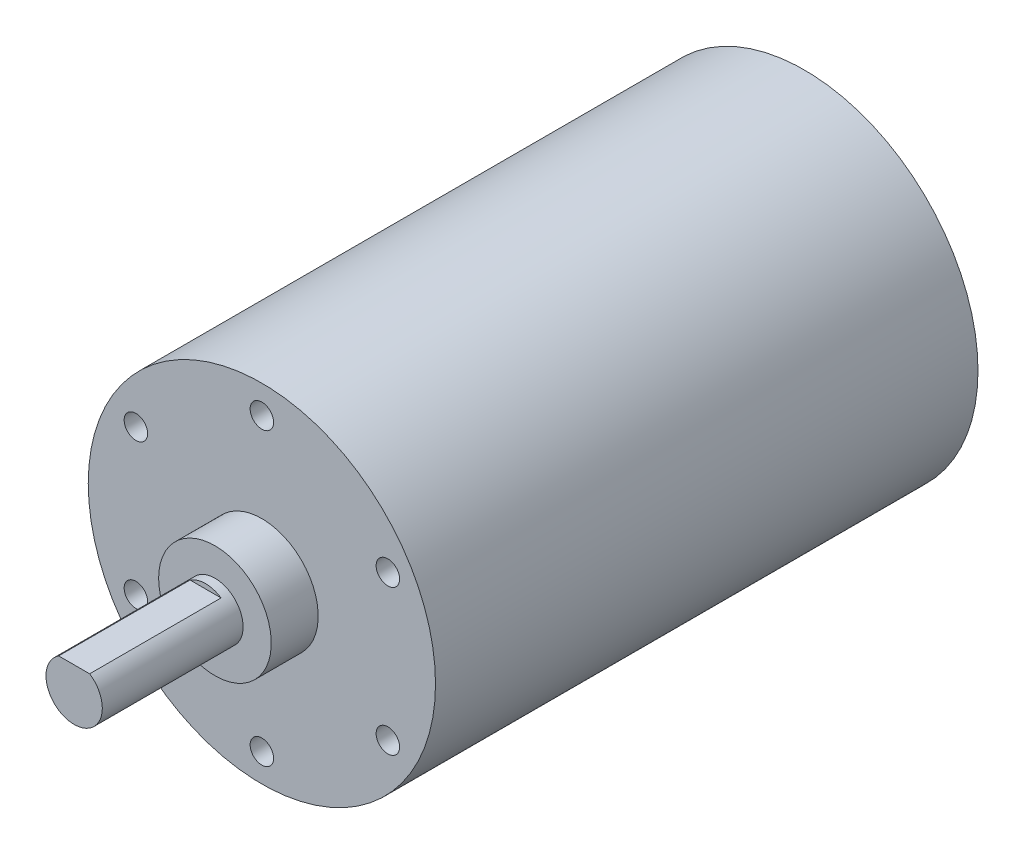
ISO-10303-21;
HEADER;
FILE_DESCRIPTION(('STEP AP214'),'2;1');
FILE_NAME('part.step','',(''),(''),'','','');
FILE_SCHEMA(('AUTOMOTIVE_DESIGN { 1 0 10303 214 1 1 1 1 }'));
ENDSEC;
DATA;
#1=APPLICATION_CONTEXT('core data for automotive mechanical design processes');
#2=APPLICATION_PROTOCOL_DEFINITION('international standard','automotive_design',2000,#1);
#3=PRODUCT_CONTEXT('',#1,'mechanical');
#4=PRODUCT('Part','Part','',(#3));
#5=PRODUCT_RELATED_PRODUCT_CATEGORY('part','',(#4));
#6=PRODUCT_DEFINITION_FORMATION('','',#4);
#7=PRODUCT_DEFINITION_CONTEXT('part definition',#1,'design');
#8=PRODUCT_DEFINITION('design','',#6,#7);
#9=PRODUCT_DEFINITION_SHAPE('','',#8);
#10=(LENGTH_UNIT() NAMED_UNIT(*) SI_UNIT(.MILLI.,.METRE.));
#11=(NAMED_UNIT(*) PLANE_ANGLE_UNIT() SI_UNIT($,.RADIAN.));
#12=(NAMED_UNIT(*) SI_UNIT($,.STERADIAN.) SOLID_ANGLE_UNIT());
#13=UNCERTAINTY_MEASURE_WITH_UNIT(LENGTH_MEASURE(1.E-05),#10,'distance_accuracy_value','');
#14=(GEOMETRIC_REPRESENTATION_CONTEXT(3) GLOBAL_UNCERTAINTY_ASSIGNED_CONTEXT((#13)) GLOBAL_UNIT_ASSIGNED_CONTEXT((#10,
#11,#12)) REPRESENTATION_CONTEXT('',''));
#15=CARTESIAN_POINT('',(0.,0.,0.));
#16=DIRECTION('',(0.,0.,1.));
#17=DIRECTION('',(1.,0.,0.));
#18=AXIS2_PLACEMENT_3D('',#15,#16,#17);
#19=CARTESIAN_POINT('',(0.,0.,-57.8000114));
#20=DIRECTION('',(0.,0.,1.));
#21=DIRECTION('',(1.,0.,0.));
#22=AXIS2_PLACEMENT_3D('',#19,#20,#21);
#23=CYLINDRICAL_SURFACE('',#22,18.499963);
#24=CARTESIAN_POINT('',(0.,0.,-57.8000114));
#25=DIRECTION('',(0.,0.,1.));
#26=DIRECTION('',(1.,0.,0.));
#27=AXIS2_PLACEMENT_3D('',#24,#25,#26);
#28=CIRCLE('',#27,18.499963);
#29=CARTESIAN_POINT('',(18.499963,0.,-57.8000114));
#30=VERTEX_POINT('',#29);
#31=EDGE_CURVE('E53',#30,#30,#28,.T.);
#32=CARTESIAN_POINT('',(0.,0.,0.));
#33=DIRECTION('',(0.,0.,1.));
#34=DIRECTION('',(1.,0.,0.));
#35=AXIS2_PLACEMENT_3D('',#32,#33,#34);
#36=CIRCLE('',#35,18.499963);
#37=CARTESIAN_POINT('',(18.499963,0.,0.));
#38=VERTEX_POINT('',#37);
#39=EDGE_CURVE('E88',#38,#38,#36,.T.);
#40=CARTESIAN_POINT('',(18.499963,0.,-57.8000114));
#41=CARTESIAN_POINT('',(18.499963,0.,-57.1979279479167));
#42=CARTESIAN_POINT('',(18.499963,0.,-56.5958444958333));
#43=CARTESIAN_POINT('',(18.499963,0.,-55.3916775916667));
#44=CARTESIAN_POINT('',(18.499963,0.,-54.7895941395833));
#45=CARTESIAN_POINT('',(18.499963,0.,-53.5854272354167));
#46=CARTESIAN_POINT('',(18.499963,0.,-52.9833437833333));
#47=CARTESIAN_POINT('',(18.499963,0.,-51.7791768791667));
#48=CARTESIAN_POINT('',(18.499963,0.,-51.1770934270833));
#49=CARTESIAN_POINT('',(18.499963,0.,-49.9729265229167));
#50=CARTESIAN_POINT('',(18.499963,0.,-49.3708430708333));
#51=CARTESIAN_POINT('',(18.499963,0.,-48.1666761666667));
#52=CARTESIAN_POINT('',(18.499963,0.,-47.5645927145833));
#53=CARTESIAN_POINT('',(18.499963,0.,-46.3604258104167));
#54=CARTESIAN_POINT('',(18.499963,0.,-45.7583423583333));
#55=CARTESIAN_POINT('',(18.499963,0.,-44.5541754541667));
#56=CARTESIAN_POINT('',(18.499963,0.,-43.9520920020833));
#57=CARTESIAN_POINT('',(18.499963,0.,-42.7479250979167));
#58=CARTESIAN_POINT('',(18.499963,0.,-42.1458416458333));
#59=CARTESIAN_POINT('',(18.499963,0.,-40.9416747416667));
#60=CARTESIAN_POINT('',(18.499963,0.,-40.3395912895833));
#61=CARTESIAN_POINT('',(18.499963,0.,-39.1354243854167));
#62=CARTESIAN_POINT('',(18.499963,0.,-38.5333409333333));
#63=CARTESIAN_POINT('',(18.499963,0.,-37.3291740291667));
#64=CARTESIAN_POINT('',(18.499963,0.,-36.7270905770833));
#65=CARTESIAN_POINT('',(18.499963,0.,-35.5229236729167));
#66=CARTESIAN_POINT('',(18.499963,0.,-34.9208402208333));
#67=CARTESIAN_POINT('',(18.499963,0.,-33.7166733166667));
#68=CARTESIAN_POINT('',(18.499963,0.,-33.1145898645833));
#69=CARTESIAN_POINT('',(18.499963,0.,-31.9104229604167));
#70=CARTESIAN_POINT('',(18.499963,0.,-31.3083395083333));
#71=CARTESIAN_POINT('',(18.499963,0.,-30.1041726041667));
#72=CARTESIAN_POINT('',(18.499963,0.,-29.5020891520833));
#73=CARTESIAN_POINT('',(18.499963,0.,-28.2979222479167));
#74=CARTESIAN_POINT('',(18.499963,0.,-27.6958387958333));
#75=CARTESIAN_POINT('',(18.499963,0.,-26.4916718916667));
#76=CARTESIAN_POINT('',(18.499963,0.,-25.8895884395833));
#77=CARTESIAN_POINT('',(18.499963,0.,-24.6854215354167));
#78=CARTESIAN_POINT('',(18.499963,0.,-24.0833380833333));
#79=CARTESIAN_POINT('',(18.499963,0.,-22.8791711791667));
#80=CARTESIAN_POINT('',(18.499963,0.,-22.2770877270833));
#81=CARTESIAN_POINT('',(18.499963,0.,-21.0729208229167));
#82=CARTESIAN_POINT('',(18.499963,0.,-20.4708373708333));
#83=CARTESIAN_POINT('',(18.499963,0.,-19.2666704666667));
#84=CARTESIAN_POINT('',(18.499963,0.,-18.6645870145833));
#85=CARTESIAN_POINT('',(18.499963,0.,-17.4604201104167));
#86=CARTESIAN_POINT('',(18.499963,0.,-16.8583366583333));
#87=CARTESIAN_POINT('',(18.499963,0.,-15.6541697541667));
#88=CARTESIAN_POINT('',(18.499963,0.,-15.0520863020833));
#89=CARTESIAN_POINT('',(18.499963,0.,-13.8479193979167));
#90=CARTESIAN_POINT('',(18.499963,0.,-13.2458359458333));
#91=CARTESIAN_POINT('',(18.499963,0.,-12.0416690416667));
#92=CARTESIAN_POINT('',(18.499963,0.,-11.4395855895833));
#93=CARTESIAN_POINT('',(18.499963,0.,-10.2354186854167));
#94=CARTESIAN_POINT('',(18.499963,0.,-9.63333523333333));
#95=CARTESIAN_POINT('',(18.499963,0.,-8.42916832916667));
#96=CARTESIAN_POINT('',(18.499963,0.,-7.82708487708334));
#97=CARTESIAN_POINT('',(18.499963,0.,-6.62291797291667));
#98=CARTESIAN_POINT('',(18.499963,0.,-6.02083452083333));
#99=CARTESIAN_POINT('',(18.499963,0.,-4.81666761666667));
#100=CARTESIAN_POINT('',(18.499963,0.,-4.21458416458333));
#101=CARTESIAN_POINT('',(18.499963,0.,-3.01041726041667));
#102=CARTESIAN_POINT('',(18.499963,0.,-2.40833380833333));
#103=CARTESIAN_POINT('',(18.499963,0.,-1.20416690416666));
#104=CARTESIAN_POINT('',(18.499963,0.,-0.602083452083332));
#105=CARTESIAN_POINT('',(18.499963,0.,0.));
#106=B_SPLINE_CURVE_WITH_KNOTS('',3,(#40,#41,#42,#43,#44,#45,#46,#47,#48,#49,#50,#51,#52,#53,
#54,#55,#56,#57,#58,#59,#60,#61,#62,#63,#64,#65,#66,#67,#68,#69,#70,#71,#72,#73,#74,#75,#76,#77,
#78,#79,#80,#81,#82,#83,#84,#85,#86,#87,#88,#89,#90,#91,#92,#93,#94,#95,#96,#97,#98,#99,#100,
#101,#102,#103,#104,#105),.UNSPECIFIED.,.F.,.F.,(4,2,2,2,2,2,2,2,2,2,2,2,2,2,2,2,2,2,2,2,2,2,2,
2,2,2,2,2,2,2,2,2,4),(0.,1.80625035625,3.6125007125,5.41875106875001,7.225001425,9.03125178125,
10.8375021375,12.64375249375,14.45000285,16.25625320625,18.0625035625,19.86875391875,
21.675004275,23.48125463125,25.2875049875,27.09375534375,28.9000057,30.70625605625,
32.5125064125,34.31875676875,36.125007125,37.93125748125,39.7375078375,41.54375819375,
43.35000855,45.15625890625,46.9625092625,48.76875961875,50.575009975,52.38126033125,
54.1875106875,55.99376104375,57.8000114),.UNSPECIFIED.);
#107=EDGE_CURVE('BSEAM45',#30,#38,#106,.T.);
#108=ORIENTED_EDGE('',*,*,#31,.T.);
#109=ORIENTED_EDGE('',*,*,#39,.F.);
#110=ORIENTED_EDGE('',*,*,#107,.T.);
#111=ORIENTED_EDGE('',*,*,#107,.F.);
#112=EDGE_LOOP('',(#108,#110,#109,#111));
#113=FACE_BOUND('',#112,.T.);
#114=ADVANCED_FACE('F45',(#113),#23,.T.);
#115=CARTESIAN_POINT('',(0.,0.,-57.8000114));
#116=DIRECTION('',(0.,0.,1.));
#117=DIRECTION('',(1.,0.,0.));
#118=AXIS2_PLACEMENT_3D('',#115,#116,#117);
#119=PLANE('',#118);
#120=ORIENTED_EDGE('',*,*,#31,.F.);
#121=EDGE_LOOP('',(#120));
#122=FACE_BOUND('',#121,.T.);
#123=ADVANCED_FACE('F107',(#122),#119,.F.);
#124=CARTESIAN_POINT('',(0.,0.,0.));
#125=DIRECTION('',(0.,0.,1.));
#126=DIRECTION('',(1.,0.,0.));
#127=AXIS2_PLACEMENT_3D('',#124,#125,#126);
#128=PLANE('',#127);
#129=CARTESIAN_POINT('',(-1.08235705032294E-13,-15.499969,0.));
#130=DIRECTION('',(0.,0.,1.));
#131=DIRECTION('',(1.,0.,0.));
#132=AXIS2_PLACEMENT_3D('',#129,#130,#131);
#133=CIRCLE('',#132,1.25000004);
#134=CARTESIAN_POINT('',(1.25000003999989,-15.499969,0.));
#135=VERTEX_POINT('',#134);
#136=EDGE_CURVE('E324',#135,#135,#133,.T.);
#137=ORIENTED_EDGE('',*,*,#136,.F.);
#138=EDGE_LOOP('',(#137));
#139=FACE_BOUND('',#138,.T.);
#140=CARTESIAN_POINT('',(-13.4233669118714,-7.74998449999988,0.));
#141=DIRECTION('',(0.,0.,1.));
#142=DIRECTION('',(1.,0.,0.));
#143=AXIS2_PLACEMENT_3D('',#140,#141,#142);
#144=CIRCLE('',#143,1.25000004);
#145=CARTESIAN_POINT('',(-12.1733668718714,-7.74998449999988,0.));
#146=VERTEX_POINT('',#145);
#147=EDGE_CURVE('E333',#146,#146,#144,.T.);
#148=ORIENTED_EDGE('',*,*,#147,.F.);
#149=EDGE_LOOP('',(#148));
#150=FACE_BOUND('',#149,.T.);
#151=CARTESIAN_POINT('',(13.4233669118713,7.74998449999997,0.));
#152=DIRECTION('',(0.,0.,1.));
#153=DIRECTION('',(1.,0.,0.));
#154=AXIS2_PLACEMENT_3D('',#151,#152,#153);
#155=CIRCLE('',#154,1.25000004);
#156=CARTESIAN_POINT('',(14.6733669518713,7.74998449999997,0.));
#157=VERTEX_POINT('',#156);
#158=EDGE_CURVE('E341',#157,#157,#155,.T.);
#159=ORIENTED_EDGE('',*,*,#158,.F.);
#160=EDGE_LOOP('',(#159));
#161=FACE_BOUND('',#160,.T.);
#162=CARTESIAN_POINT('',(0.,15.499969,0.));
#163=DIRECTION('',(0.,0.,1.));
#164=DIRECTION('',(1.,0.,0.));
#165=AXIS2_PLACEMENT_3D('',#162,#163,#164);
#166=CIRCLE('',#165,1.25000004);
#167=CARTESIAN_POINT('',(1.25000004,15.499969,0.));
#168=VERTEX_POINT('',#167);
#169=EDGE_CURVE('E319',#168,#168,#166,.T.);
#170=ORIENTED_EDGE('',*,*,#169,.F.);
#171=EDGE_LOOP('',(#170));
#172=FACE_BOUND('',#171,.T.);
#173=CARTESIAN_POINT('',(-13.4233669118712,7.74998450000016,0.));
#174=DIRECTION('',(0.,0.,1.));
#175=DIRECTION('',(1.,0.,0.));
#176=AXIS2_PLACEMENT_3D('',#173,#174,#175);
#177=CIRCLE('',#176,1.25000004);
#178=CARTESIAN_POINT('',(-12.1733668718712,7.74998450000016,0.));
#179=VERTEX_POINT('',#178);
#180=EDGE_CURVE('E311',#179,#179,#177,.T.);
#181=ORIENTED_EDGE('',*,*,#180,.F.);
#182=EDGE_LOOP('',(#181));
#183=FACE_BOUND('',#182,.T.);
#184=CARTESIAN_POINT('',(13.4233669118712,-7.74998450000006,0.));
#185=DIRECTION('',(0.,0.,1.));
#186=DIRECTION('',(1.,0.,0.));
#187=AXIS2_PLACEMENT_3D('',#184,#185,#186);
#188=CIRCLE('',#187,1.25000004);
#189=CARTESIAN_POINT('',(14.6733669518712,-7.74998450000006,0.));
#190=VERTEX_POINT('',#189);
#191=EDGE_CURVE('E328',#190,#190,#188,.T.);
#192=ORIENTED_EDGE('',*,*,#191,.F.);
#193=EDGE_LOOP('',(#192));
#194=FACE_BOUND('',#193,.T.);
#195=CARTESIAN_POINT('',(0.,0.,0.));
#196=DIRECTION('',(0.,0.,1.));
#197=DIRECTION('',(1.,0.,0.));
#198=AXIS2_PLACEMENT_3D('',#195,#196,#197);
#199=CIRCLE('',#198,6.0000007);
#200=CARTESIAN_POINT('',(-6.0000007,0.,0.));
#201=VERTEX_POINT('',#200);
#202=EDGE_CURVE('E99',#201,#201,#199,.T.);
#203=ORIENTED_EDGE('',*,*,#202,.F.);
#204=EDGE_LOOP('',(#203));
#205=FACE_BOUND('',#204,.T.);
#206=ORIENTED_EDGE('',*,*,#39,.T.);
#207=EDGE_LOOP('',(#206));
#208=FACE_BOUND('',#207,.T.);
#209=ADVANCED_FACE('F109',(#139,#150,#161,#172,#183,#194,#205,#208),#128,.T.);
#210=CARTESIAN_POINT('',(0.,0.,5.0000154));
#211=DIRECTION('',(0.,0.,-1.));
#212=DIRECTION('',(-1.,0.,0.));
#213=AXIS2_PLACEMENT_3D('',#210,#211,#212);
#214=CYLINDRICAL_SURFACE('',#213,6.0000007);
#215=CARTESIAN_POINT('',(0.,0.,5.0000154));
#216=DIRECTION('',(0.,0.,1.));
#217=DIRECTION('',(1.,0.,0.));
#218=AXIS2_PLACEMENT_3D('',#215,#216,#217);
#219=CIRCLE('',#218,6.0000007);
#220=CARTESIAN_POINT('',(-6.0000007,0.,5.0000154));
#221=VERTEX_POINT('',#220);
#222=EDGE_CURVE('E96',#221,#221,#219,.T.);
#223=CARTESIAN_POINT('',(-6.0000007,0.,5.0000154));
#224=CARTESIAN_POINT('',(-6.0000007,0.,4.94793190625));
#225=CARTESIAN_POINT('',(-6.0000007,0.,4.8958484125));
#226=CARTESIAN_POINT('',(-6.0000007,0.,4.791681425));
#227=CARTESIAN_POINT('',(-6.0000007,0.,4.73959793125));
#228=CARTESIAN_POINT('',(-6.0000007,0.,4.63543094375));
#229=CARTESIAN_POINT('',(-6.0000007,0.,4.58334745));
#230=CARTESIAN_POINT('',(-6.0000007,0.,4.4791804625));
#231=CARTESIAN_POINT('',(-6.0000007,0.,4.42709696875));
#232=CARTESIAN_POINT('',(-6.0000007,0.,4.32292998125));
#233=CARTESIAN_POINT('',(-6.0000007,0.,4.2708464875));
#234=CARTESIAN_POINT('',(-6.0000007,0.,4.1666795));
#235=CARTESIAN_POINT('',(-6.0000007,0.,4.11459600625));
#236=CARTESIAN_POINT('',(-6.0000007,0.,4.01042901875));
#237=CARTESIAN_POINT('',(-6.0000007,0.,3.958345525));
#238=CARTESIAN_POINT('',(-6.0000007,0.,3.8541785375));
#239=CARTESIAN_POINT('',(-6.0000007,0.,3.80209504375));
#240=CARTESIAN_POINT('',(-6.0000007,0.,3.69792805625));
#241=CARTESIAN_POINT('',(-6.0000007,0.,3.6458445625));
#242=CARTESIAN_POINT('',(-6.0000007,0.,3.541677575));
#243=CARTESIAN_POINT('',(-6.0000007,0.,3.48959408125));
#244=CARTESIAN_POINT('',(-6.0000007,0.,3.38542709375));
#245=CARTESIAN_POINT('',(-6.0000007,0.,3.3333436));
#246=CARTESIAN_POINT('',(-6.0000007,0.,3.2291766125));
#247=CARTESIAN_POINT('',(-6.0000007,0.,3.17709311875));
#248=CARTESIAN_POINT('',(-6.0000007,0.,3.07292613125));
#249=CARTESIAN_POINT('',(-6.0000007,0.,3.0208426375));
#250=CARTESIAN_POINT('',(-6.0000007,0.,2.91667565));
#251=CARTESIAN_POINT('',(-6.0000007,0.,2.86459215625));
#252=CARTESIAN_POINT('',(-6.0000007,0.,2.76042516875));
#253=CARTESIAN_POINT('',(-6.0000007,0.,2.708341675));
#254=CARTESIAN_POINT('',(-6.0000007,0.,2.6041746875));
#255=CARTESIAN_POINT('',(-6.0000007,0.,2.55209119375));
#256=CARTESIAN_POINT('',(-6.0000007,0.,2.44792420625));
#257=CARTESIAN_POINT('',(-6.0000007,0.,2.3958407125));
#258=CARTESIAN_POINT('',(-6.0000007,0.,2.291673725));
#259=CARTESIAN_POINT('',(-6.0000007,0.,2.23959023125));
#260=CARTESIAN_POINT('',(-6.0000007,0.,2.13542324375));
#261=CARTESIAN_POINT('',(-6.0000007,0.,2.08333975));
#262=CARTESIAN_POINT('',(-6.0000007,0.,1.9791727625));
#263=CARTESIAN_POINT('',(-6.0000007,0.,1.92708926875));
#264=CARTESIAN_POINT('',(-6.0000007,0.,1.82292228125));
#265=CARTESIAN_POINT('',(-6.0000007,0.,1.7708387875));
#266=CARTESIAN_POINT('',(-6.0000007,0.,1.6666718));
#267=CARTESIAN_POINT('',(-6.0000007,0.,1.61458830625));
#268=CARTESIAN_POINT('',(-6.0000007,0.,1.51042131875));
#269=CARTESIAN_POINT('',(-6.0000007,0.,1.458337825));
#270=CARTESIAN_POINT('',(-6.0000007,0.,1.3541708375));
#271=CARTESIAN_POINT('',(-6.0000007,0.,1.30208734375));
#272=CARTESIAN_POINT('',(-6.0000007,0.,1.19792035625));
#273=CARTESIAN_POINT('',(-6.0000007,0.,1.1458368625));
#274=CARTESIAN_POINT('',(-6.0000007,0.,1.041669875));
#275=CARTESIAN_POINT('',(-6.0000007,0.,0.989586381249999));
#276=CARTESIAN_POINT('',(-6.0000007,0.,0.885419393749999));
#277=CARTESIAN_POINT('',(-6.0000007,0.,0.833335899999999));
#278=CARTESIAN_POINT('',(-6.0000007,0.,0.729168912499999));
#279=CARTESIAN_POINT('',(-6.0000007,0.,0.677085418749999));
#280=CARTESIAN_POINT('',(-6.0000007,0.,0.572918431249999));
#281=CARTESIAN_POINT('',(-6.0000007,0.,0.520834937499999));
#282=CARTESIAN_POINT('',(-6.0000007,0.,0.416667949999999));
#283=CARTESIAN_POINT('',(-6.0000007,0.,0.364584456249999));
#284=CARTESIAN_POINT('',(-6.0000007,0.,0.260417468749999));
#285=CARTESIAN_POINT('',(-6.0000007,0.,0.208333974999999));
#286=CARTESIAN_POINT('',(-6.0000007,0.,0.104166987499999));
#287=CARTESIAN_POINT('',(-6.0000007,0.,0.0520834937499991));
#288=CARTESIAN_POINT('',(-6.0000007,0.,0.));
#289=B_SPLINE_CURVE_WITH_KNOTS('',3,(#223,#224,#225,#226,#227,#228,#229,#230,#231,#232,#233,
#234,#235,#236,#237,#238,#239,#240,#241,#242,#243,#244,#245,#246,#247,#248,#249,#250,#251,#252,
#253,#254,#255,#256,#257,#258,#259,#260,#261,#262,#263,#264,#265,#266,#267,#268,#269,#270,#271,
#272,#273,#274,#275,#276,#277,#278,#279,#280,#281,#282,#283,#284,#285,#286,#287,#288),
.UNSPECIFIED.,.F.,.F.,(4,2,2,2,2,2,2,2,2,2,2,2,2,2,2,2,2,2,2,2,2,2,2,2,2,2,2,2,2,2,2,2,4),(0.,
0.15625048125,0.3125009625,0.46875144375,0.625001925,0.78125240625,0.9375028875,1.09375336875,
1.25000385,1.40625433125,1.5625048125,1.71875529375,1.875005775,2.03125625625,2.1875067375,
2.34375721875,2.5000077,2.65625818125,2.8125086625,2.96875914375,3.125009625,3.28126010625,
3.4375105875,3.59376106875,3.75001155,3.90626203125,4.0625125125,4.21876299375,4.375013475,
4.53126395625,4.6875144375,4.84376491875,5.0000154),.UNSPECIFIED.);
#290=EDGE_CURVE('BSEAM116',#221,#201,#289,.T.);
#291=ORIENTED_EDGE('',*,*,#222,.F.);
#292=ORIENTED_EDGE('',*,*,#202,.T.);
#293=ORIENTED_EDGE('',*,*,#290,.T.);
#294=ORIENTED_EDGE('',*,*,#290,.F.);
#295=EDGE_LOOP('',(#291,#293,#292,#294));
#296=FACE_BOUND('',#295,.T.);
#297=ADVANCED_FACE('F116',(#296),#214,.T.);
#298=CARTESIAN_POINT('',(0.,0.,5.0000154));
#299=DIRECTION('',(0.,0.,1.));
#300=DIRECTION('',(1.,0.,0.));
#301=AXIS2_PLACEMENT_3D('',#298,#299,#300);
#302=PLANE('',#301);
#303=CARTESIAN_POINT('',(0.,0.,5.0000154));
#304=DIRECTION('',(0.,0.,1.));
#305=DIRECTION('',(1.,0.,0.));
#306=AXIS2_PLACEMENT_3D('',#303,#304,#305);
#307=CIRCLE('',#306,2.999994);
#308=CARTESIAN_POINT('',(2.999994,0.,5.0000154));
#309=VERTEX_POINT('',#308);
#310=EDGE_CURVE('E89',#309,#309,#307,.T.);
#311=ORIENTED_EDGE('',*,*,#310,.F.);
#312=EDGE_LOOP('',(#311));
#313=FACE_BOUND('',#312,.T.);
#314=ORIENTED_EDGE('',*,*,#222,.T.);
#315=EDGE_LOOP('',(#314));
#316=FACE_BOUND('',#315,.T.);
#317=ADVANCED_FACE('F124',(#313,#316),#302,.T.);
#318=CARTESIAN_POINT('',(0.,0.,20.00001334));
#319=DIRECTION('',(0.,0.,1.));
#320=DIRECTION('',(1.,0.,0.));
#321=AXIS2_PLACEMENT_3D('',#318,#319,#320);
#322=PLANE('',#321);
#323=DIRECTION('',(1.,0.,0.));
#324=VECTOR('',#323,1.);
#325=CARTESIAN_POINT('',(-1.65278698587881,2.50364917257703,20.00001334));
#326=LINE('',#325,#324);
#327=CARTESIAN_POINT('',(-1.65278698587881,2.50364917257703,20.00001334));
#328=VERTEX_POINT('',#327);
#329=CARTESIAN_POINT('',(1.65278698587881,2.50364917257703,20.00001334));
#330=VERTEX_POINT('',#329);
#331=EDGE_CURVE('E72',#328,#330,#326,.T.);
#332=ORIENTED_EDGE('',*,*,#331,.F.);
#333=CARTESIAN_POINT('',(0.,0.,20.00001334));
#334=DIRECTION('',(0.,0.,1.));
#335=DIRECTION('',(1.,0.,0.));
#336=AXIS2_PLACEMENT_3D('',#333,#334,#335);
#337=CIRCLE('',#336,2.999994);
#338=EDGE_CURVE('E82',#328,#330,#337,.T.);
#339=ORIENTED_EDGE('',*,*,#338,.T.);
#340=EDGE_LOOP('',(#332,#339));
#341=FACE_BOUND('',#340,.T.);
#342=ADVANCED_FACE('F81',(#341),#322,.T.);
#343=CARTESIAN_POINT('',(0.,0.,20.00001334));
#344=DIRECTION('',(0.,0.,-1.));
#345=DIRECTION('',(-1.,0.,0.));
#346=AXIS2_PLACEMENT_3D('',#343,#344,#345);
#347=CYLINDRICAL_SURFACE('',#346,2.999994);
#348=ORIENTED_EDGE('',*,*,#338,.F.);
#349=DIRECTION('',(0.,0.,1.));
#350=VECTOR('',#349,1.);
#351=CARTESIAN_POINT('',(-1.65278698587881,2.50364917257703,6.00001594));
#352=LINE('',#351,#350);
#353=CARTESIAN_POINT('',(-1.65278698587881,2.50364917257703,6.00001594));
#354=VERTEX_POINT('',#353);
#355=EDGE_CURVE('E69',#354,#328,#352,.T.);
#356=ORIENTED_EDGE('',*,*,#355,.F.);
#357=CARTESIAN_POINT('',(0.,0.,6.00001594));
#358=DIRECTION('',(0.,0.,1.));
#359=DIRECTION('',(1.,0.,0.));
#360=AXIS2_PLACEMENT_3D('',#357,#358,#359);
#361=CIRCLE('',#360,2.999994);
#362=CARTESIAN_POINT('',(1.65278698587881,2.50364917257703,6.00001594));
#363=VERTEX_POINT('',#362);
#364=EDGE_CURVE('E11',#363,#354,#361,.T.);
#365=ORIENTED_EDGE('',*,*,#364,.F.);
#366=DIRECTION('',(0.,0.,1.));
#367=VECTOR('',#366,1.);
#368=CARTESIAN_POINT('',(1.65278698587881,2.50364917257703,6.00001594));
#369=LINE('',#368,#367);
#370=EDGE_CURVE('E77',#363,#330,#369,.T.);
#371=ORIENTED_EDGE('',*,*,#370,.T.);
#372=EDGE_LOOP('',(#348,#356,#365,#371));
#373=FACE_BOUND('',#372,.T.);
#374=ORIENTED_EDGE('',*,*,#310,.T.);
#375=EDGE_LOOP('',(#374));
#376=FACE_BOUND('',#375,.T.);
#377=ADVANCED_FACE('F85',(#373,#376),#347,.T.);
#378=CARTESIAN_POINT('',(13.4233669118712,-7.74998450000006,-8.89));
#379=DIRECTION('',(0.,0.,1.));
#380=DIRECTION('',(1.,0.,0.));
#381=AXIS2_PLACEMENT_3D('',#378,#379,#380);
#382=CYLINDRICAL_SURFACE('',#381,1.25000004);
#383=CARTESIAN_POINT('',(13.4233669118712,-7.74998450000006,-8.89));
#384=DIRECTION('',(0.,0.,1.));
#385=DIRECTION('',(1.,0.,0.));
#386=AXIS2_PLACEMENT_3D('',#383,#384,#385);
#387=CIRCLE('',#386,1.25000004);
#388=CARTESIAN_POINT('',(14.6733669518712,-7.74998450000006,-8.89));
#389=VERTEX_POINT('',#388);
#390=EDGE_CURVE('E352',#389,#389,#387,.T.);
#391=ORIENTED_EDGE('',*,*,#390,.F.);
#392=EDGE_LOOP('',(#391));
#393=FACE_BOUND('',#392,.T.);
#394=ORIENTED_EDGE('',*,*,#191,.T.);
#395=EDGE_LOOP('',(#394));
#396=FACE_BOUND('',#395,.T.);
#397=ADVANCED_FACE('F121',(#393,#396),#382,.F.);
#398=CARTESIAN_POINT('',(13.4233669118712,-7.74998450000006,-8.89));
#399=DIRECTION('',(0.,0.,1.));
#400=DIRECTION('',(1.,0.,0.));
#401=AXIS2_PLACEMENT_3D('',#398,#399,#400);
#402=PLANE('',#401);
#403=ORIENTED_EDGE('',*,*,#390,.T.);
#404=EDGE_LOOP('',(#403));
#405=FACE_BOUND('',#404,.T.);
#406=ADVANCED_FACE('F132',(#405),#402,.T.);
#407=CARTESIAN_POINT('',(-13.4233669118712,7.74998450000016,-8.89));
#408=DIRECTION('',(0.,0.,1.));
#409=DIRECTION('',(1.,0.,0.));
#410=AXIS2_PLACEMENT_3D('',#407,#408,#409);
#411=CYLINDRICAL_SURFACE('',#410,1.25000004);
#412=CARTESIAN_POINT('',(-13.4233669118712,7.74998450000016,-8.89));
#413=DIRECTION('',(0.,0.,1.));
#414=DIRECTION('',(1.,0.,0.));
#415=AXIS2_PLACEMENT_3D('',#412,#413,#414);
#416=CIRCLE('',#415,1.25000004);
#417=CARTESIAN_POINT('',(-12.1733668718712,7.74998450000016,-8.89));
#418=VERTEX_POINT('',#417);
#419=EDGE_CURVE('E308',#418,#418,#416,.T.);
#420=ORIENTED_EDGE('',*,*,#419,.F.);
#421=EDGE_LOOP('',(#420));
#422=FACE_BOUND('',#421,.T.);
#423=ORIENTED_EDGE('',*,*,#180,.T.);
#424=EDGE_LOOP('',(#423));
#425=FACE_BOUND('',#424,.T.);
#426=ADVANCED_FACE('F136',(#422,#425),#411,.F.);
#427=CARTESIAN_POINT('',(-13.4233669118712,7.74998450000016,-8.89));
#428=DIRECTION('',(0.,0.,1.));
#429=DIRECTION('',(1.,0.,0.));
#430=AXIS2_PLACEMENT_3D('',#427,#428,#429);
#431=PLANE('',#430);
#432=ORIENTED_EDGE('',*,*,#419,.T.);
#433=EDGE_LOOP('',(#432));
#434=FACE_BOUND('',#433,.T.);
#435=ADVANCED_FACE('F146',(#434),#431,.T.);
#436=CARTESIAN_POINT('',(0.,15.499969,-8.89));
#437=DIRECTION('',(0.,0.,1.));
#438=DIRECTION('',(1.,0.,0.));
#439=AXIS2_PLACEMENT_3D('',#436,#437,#438);
#440=CYLINDRICAL_SURFACE('',#439,1.25000004);
#441=CARTESIAN_POINT('',(0.,15.499969,-8.89));
#442=DIRECTION('',(0.,0.,1.));
#443=DIRECTION('',(1.,0.,0.));
#444=AXIS2_PLACEMENT_3D('',#441,#442,#443);
#445=CIRCLE('',#444,1.25000004);
#446=CARTESIAN_POINT('',(1.25000004,15.499969,-8.89));
#447=VERTEX_POINT('',#446);
#448=EDGE_CURVE('E314',#447,#447,#445,.T.);
#449=ORIENTED_EDGE('',*,*,#448,.F.);
#450=EDGE_LOOP('',(#449));
#451=FACE_BOUND('',#450,.T.);
#452=ORIENTED_EDGE('',*,*,#169,.T.);
#453=EDGE_LOOP('',(#452));
#454=FACE_BOUND('',#453,.T.);
#455=ADVANCED_FACE('F142',(#451,#454),#440,.F.);
#456=CARTESIAN_POINT('',(0.,15.499969,-8.89));
#457=DIRECTION('',(0.,0.,1.));
#458=DIRECTION('',(1.,0.,0.));
#459=AXIS2_PLACEMENT_3D('',#456,#457,#458);
#460=PLANE('',#459);
#461=ORIENTED_EDGE('',*,*,#448,.T.);
#462=EDGE_LOOP('',(#461));
#463=FACE_BOUND('',#462,.T.);
#464=ADVANCED_FACE('F138',(#463),#460,.T.);
#465=CARTESIAN_POINT('',(13.4233669118713,7.74998449999997,-8.89));
#466=DIRECTION('',(0.,0.,1.));
#467=DIRECTION('',(1.,0.,0.));
#468=AXIS2_PLACEMENT_3D('',#465,#466,#467);
#469=CYLINDRICAL_SURFACE('',#468,1.25000004);
#470=CARTESIAN_POINT('',(13.4233669118713,7.74998449999997,-8.89));
#471=DIRECTION('',(0.,0.,1.));
#472=DIRECTION('',(1.,0.,0.));
#473=AXIS2_PLACEMENT_3D('',#470,#471,#472);
#474=CIRCLE('',#473,1.25000004);
#475=CARTESIAN_POINT('',(14.6733669518713,7.74998449999997,-8.89));
#476=VERTEX_POINT('',#475);
#477=EDGE_CURVE('E345',#476,#476,#474,.T.);
#478=ORIENTED_EDGE('',*,*,#477,.F.);
#479=EDGE_LOOP('',(#478));
#480=FACE_BOUND('',#479,.T.);
#481=ORIENTED_EDGE('',*,*,#158,.T.);
#482=EDGE_LOOP('',(#481));
#483=FACE_BOUND('',#482,.T.);
#484=ADVANCED_FACE('F141',(#480,#483),#469,.F.);
#485=CARTESIAN_POINT('',(13.4233669118713,7.74998449999997,-8.89));
#486=DIRECTION('',(0.,0.,1.));
#487=DIRECTION('',(1.,0.,0.));
#488=AXIS2_PLACEMENT_3D('',#485,#486,#487);
#489=PLANE('',#488);
#490=ORIENTED_EDGE('',*,*,#477,.T.);
#491=EDGE_LOOP('',(#490));
#492=FACE_BOUND('',#491,.T.);
#493=ADVANCED_FACE('F148',(#492),#489,.T.);
#494=CARTESIAN_POINT('',(-13.4233669118714,-7.74998449999988,-8.89));
#495=DIRECTION('',(0.,0.,1.));
#496=DIRECTION('',(1.,0.,0.));
#497=AXIS2_PLACEMENT_3D('',#494,#495,#496);
#498=CYLINDRICAL_SURFACE('',#497,1.25000004);
#499=CARTESIAN_POINT('',(-13.4233669118714,-7.74998449999988,-8.89));
#500=DIRECTION('',(0.,0.,1.));
#501=DIRECTION('',(1.,0.,0.));
#502=AXIS2_PLACEMENT_3D('',#499,#500,#501);
#503=CIRCLE('',#502,1.25000004);
#504=CARTESIAN_POINT('',(-12.1733668718714,-7.74998449999988,-8.89));
#505=VERTEX_POINT('',#504);
#506=EDGE_CURVE('E337',#505,#505,#503,.T.);
#507=ORIENTED_EDGE('',*,*,#506,.F.);
#508=EDGE_LOOP('',(#507));
#509=FACE_BOUND('',#508,.T.);
#510=ORIENTED_EDGE('',*,*,#147,.T.);
#511=EDGE_LOOP('',(#510));
#512=FACE_BOUND('',#511,.T.);
#513=ADVANCED_FACE('F151',(#509,#512),#498,.F.);
#514=CARTESIAN_POINT('',(-13.4233669118714,-7.74998449999988,-8.89));
#515=DIRECTION('',(0.,0.,1.));
#516=DIRECTION('',(1.,0.,0.));
#517=AXIS2_PLACEMENT_3D('',#514,#515,#516);
#518=PLANE('',#517);
#519=ORIENTED_EDGE('',*,*,#506,.T.);
#520=EDGE_LOOP('',(#519));
#521=FACE_BOUND('',#520,.T.);
#522=ADVANCED_FACE('F156',(#521),#518,.T.);
#523=CARTESIAN_POINT('',(-1.08235705032294E-13,-15.499969,-8.89));
#524=DIRECTION('',(0.,0.,1.));
#525=DIRECTION('',(1.,0.,0.));
#526=AXIS2_PLACEMENT_3D('',#523,#524,#525);
#527=CYLINDRICAL_SURFACE('',#526,1.25000004);
#528=CARTESIAN_POINT('',(-1.08235705032294E-13,-15.499969,-8.89));
#529=DIRECTION('',(0.,0.,1.));
#530=DIRECTION('',(1.,0.,0.));
#531=AXIS2_PLACEMENT_3D('',#528,#529,#530);
#532=CIRCLE('',#531,1.25000004);
#533=CARTESIAN_POINT('',(1.25000003999989,-15.499969,-8.89));
#534=VERTEX_POINT('',#533);
#535=EDGE_CURVE('E329',#534,#534,#532,.T.);
#536=ORIENTED_EDGE('',*,*,#535,.F.);
#537=EDGE_LOOP('',(#536));
#538=FACE_BOUND('',#537,.T.);
#539=ORIENTED_EDGE('',*,*,#136,.T.);
#540=EDGE_LOOP('',(#539));
#541=FACE_BOUND('',#540,.T.);
#542=ADVANCED_FACE('F159',(#538,#541),#527,.F.);
#543=CARTESIAN_POINT('',(-1.08235705032294E-13,-15.499969,-8.89));
#544=DIRECTION('',(0.,0.,1.));
#545=DIRECTION('',(1.,0.,0.));
#546=AXIS2_PLACEMENT_3D('',#543,#544,#545);
#547=PLANE('',#546);
#548=ORIENTED_EDGE('',*,*,#535,.T.);
#549=EDGE_LOOP('',(#548));
#550=FACE_BOUND('',#549,.T.);
#551=ADVANCED_FACE('F164',(#550),#547,.T.);
#552=CARTESIAN_POINT('',(0.,0.,6.00001594));
#553=DIRECTION('',(0.,0.,1.));
#554=DIRECTION('',(1.,0.,0.));
#555=AXIS2_PLACEMENT_3D('',#552,#553,#554);
#556=PLANE('',#555);
#557=ORIENTED_EDGE('',*,*,#364,.T.);
#558=DIRECTION('',(1.,0.,0.));
#559=VECTOR('',#558,1.);
#560=CARTESIAN_POINT('',(-1.65278698587881,2.50364917257703,6.00001594));
#561=LINE('',#560,#559);
#562=EDGE_CURVE('E58',#354,#363,#561,.T.);
#563=ORIENTED_EDGE('',*,*,#562,.T.);
#564=EDGE_LOOP('',(#557,#563));
#565=FACE_BOUND('',#564,.T.);
#566=ADVANCED_FACE('F167',(#565),#556,.T.);
#567=CARTESIAN_POINT('',(-1.65278698587881,2.50364917257703,6.00001594));
#568=DIRECTION('',(0.,-1.,0.));
#569=DIRECTION('',(0.,0.,-1.));
#570=AXIS2_PLACEMENT_3D('',#567,#568,#569);
#571=PLANE('',#570);
#572=ORIENTED_EDGE('',*,*,#331,.T.);
#573=ORIENTED_EDGE('',*,*,#370,.F.);
#574=ORIENTED_EDGE('',*,*,#562,.F.);
#575=ORIENTED_EDGE('',*,*,#355,.T.);
#576=EDGE_LOOP('',(#572,#573,#574,#575));
#577=FACE_BOUND('',#576,.T.);
#578=ADVANCED_FACE('F71',(#577),#571,.F.);
#579=CLOSED_SHELL('',(#114,#123,#209,#297,#317,#342,#377,#397,#406,#426,#435,#455,#464,#484,
#493,#513,#522,#542,#551,#566,#578));
#580=MANIFOLD_SOLID_BREP('B2',#579);
#581=ADVANCED_BREP_SHAPE_REPRESENTATION('',(#18,#580),#14);
#582=SHAPE_DEFINITION_REPRESENTATION(#9,#581);
ENDSEC;
END-ISO-10303-21;
